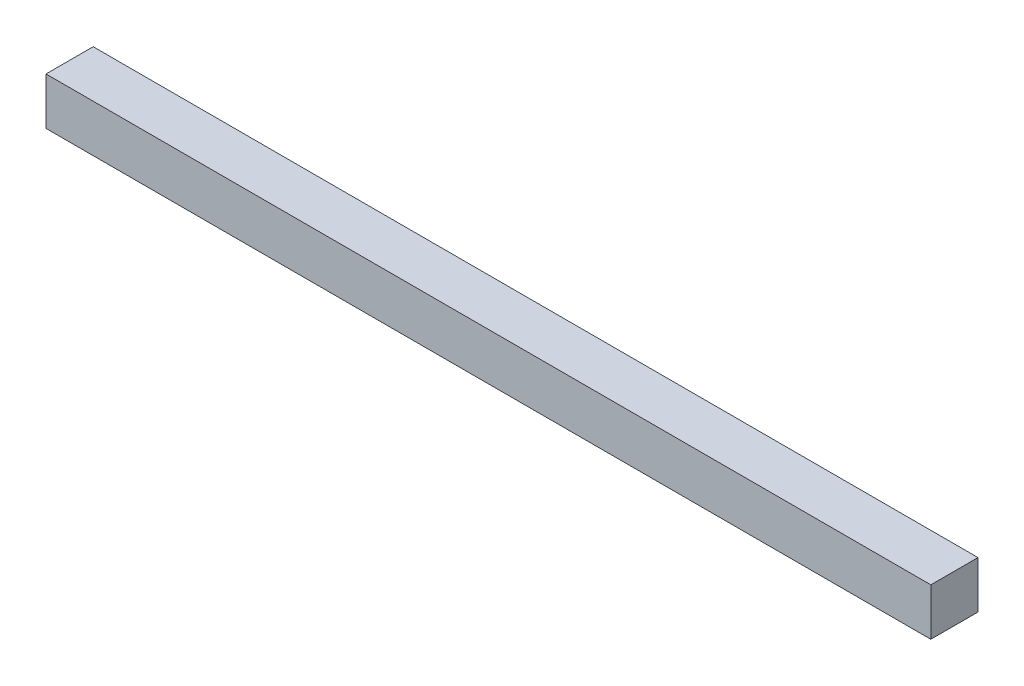
ISO-10303-21;
HEADER;
FILE_DESCRIPTION(('STEP AP214'),'2;1');
FILE_NAME('part.step','',(''),(''),'','','');
FILE_SCHEMA(('AUTOMOTIVE_DESIGN { 1 0 10303 214 1 1 1 1 }'));
ENDSEC;
DATA;
#1=APPLICATION_CONTEXT('core data for automotive mechanical design processes');
#2=APPLICATION_PROTOCOL_DEFINITION('international standard','automotive_design',2000,#1);
#3=PRODUCT_CONTEXT('',#1,'mechanical');
#4=PRODUCT('Part','Part','',(#3));
#5=PRODUCT_RELATED_PRODUCT_CATEGORY('part','',(#4));
#6=PRODUCT_DEFINITION_FORMATION('','',#4);
#7=PRODUCT_DEFINITION_CONTEXT('part definition',#1,'design');
#8=PRODUCT_DEFINITION('design','',#6,#7);
#9=PRODUCT_DEFINITION_SHAPE('','',#8);
#10=(LENGTH_UNIT() NAMED_UNIT(*) SI_UNIT(.MILLI.,.METRE.));
#11=(NAMED_UNIT(*) PLANE_ANGLE_UNIT() SI_UNIT($,.RADIAN.));
#12=(NAMED_UNIT(*) SI_UNIT($,.STERADIAN.) SOLID_ANGLE_UNIT());
#13=UNCERTAINTY_MEASURE_WITH_UNIT(LENGTH_MEASURE(1.E-05),#10,'distance_accuracy_value','');
#14=(GEOMETRIC_REPRESENTATION_CONTEXT(3) GLOBAL_UNCERTAINTY_ASSIGNED_CONTEXT((#13)) GLOBAL_UNIT_ASSIGNED_CONTEXT((#10,
#11,#12)) REPRESENTATION_CONTEXT('',''));
#15=CARTESIAN_POINT('',(0.,0.,0.));
#16=DIRECTION('',(0.,0.,1.));
#17=DIRECTION('',(1.,0.,0.));
#18=AXIS2_PLACEMENT_3D('',#15,#16,#17);
#19=CARTESIAN_POINT('',(0.,4.,0.));
#20=DIRECTION('',(1.,0.,0.));
#21=DIRECTION('',(0.,0.,-1.));
#22=AXIS2_PLACEMENT_3D('',#19,#20,#21);
#23=PLANE('',#22);
#24=DIRECTION('',(0.,0.,1.));
#25=VECTOR('',#24,1.);
#26=CARTESIAN_POINT('',(0.,0.,0.));
#27=LINE('',#26,#25);
#28=CARTESIAN_POINT('',(0.,0.,0.));
#29=VERTEX_POINT('',#28);
#30=CARTESIAN_POINT('',(0.,0.,4.));
#31=VERTEX_POINT('',#30);
#32=EDGE_CURVE('E96',#29,#31,#27,.T.);
#33=ORIENTED_EDGE('',*,*,#32,.T.);
#34=DIRECTION('',(0.,-1.,0.));
#35=VECTOR('',#34,1.);
#36=CARTESIAN_POINT('',(0.,4.,4.));
#37=LINE('',#36,#35);
#38=CARTESIAN_POINT('',(0.,4.,4.));
#39=VERTEX_POINT('',#38);
#40=EDGE_CURVE('E11',#39,#31,#37,.T.);
#41=ORIENTED_EDGE('',*,*,#40,.F.);
#42=DIRECTION('',(0.,0.,1.));
#43=VECTOR('',#42,1.);
#44=CARTESIAN_POINT('',(0.,4.,0.));
#45=LINE('',#44,#43);
#46=CARTESIAN_POINT('',(0.,4.,0.));
#47=VERTEX_POINT('',#46);
#48=EDGE_CURVE('E84',#47,#39,#45,.T.);
#49=ORIENTED_EDGE('',*,*,#48,.F.);
#50=DIRECTION('',(0.,-1.,0.));
#51=VECTOR('',#50,1.);
#52=CARTESIAN_POINT('',(0.,4.,0.));
#53=LINE('',#52,#51);
#54=EDGE_CURVE('E92',#47,#29,#53,.T.);
#55=ORIENTED_EDGE('',*,*,#54,.T.);
#56=EDGE_LOOP('',(#33,#41,#49,#55));
#57=FACE_BOUND('',#56,.T.);
#58=ADVANCED_FACE('F33',(#57),#23,.F.);
#59=CARTESIAN_POINT('',(0.,4.,4.));
#60=DIRECTION('',(0.,0.,-1.));
#61=DIRECTION('',(-1.,0.,0.));
#62=AXIS2_PLACEMENT_3D('',#59,#60,#61);
#63=PLANE('',#62);
#64=DIRECTION('',(1.,0.,0.));
#65=VECTOR('',#64,1.);
#66=CARTESIAN_POINT('',(0.,0.,4.));
#67=LINE('',#66,#65);
#68=CARTESIAN_POINT('',(75.,0.,4.));
#69=VERTEX_POINT('',#68);
#70=EDGE_CURVE('E88',#31,#69,#67,.T.);
#71=ORIENTED_EDGE('',*,*,#70,.T.);
#72=DIRECTION('',(0.,-1.,0.));
#73=VECTOR('',#72,1.);
#74=CARTESIAN_POINT('',(75.,4.,4.));
#75=LINE('',#74,#73);
#76=CARTESIAN_POINT('',(75.,4.,4.));
#77=VERTEX_POINT('',#76);
#78=EDGE_CURVE('E41',#77,#69,#75,.T.);
#79=ORIENTED_EDGE('',*,*,#78,.F.);
#80=DIRECTION('',(1.,0.,0.));
#81=VECTOR('',#80,1.);
#82=CARTESIAN_POINT('',(0.,4.,4.));
#83=LINE('',#82,#81);
#84=EDGE_CURVE('E79',#39,#77,#83,.T.);
#85=ORIENTED_EDGE('',*,*,#84,.F.);
#86=ORIENTED_EDGE('',*,*,#40,.T.);
#87=EDGE_LOOP('',(#71,#79,#85,#86));
#88=FACE_BOUND('',#87,.T.);
#89=ADVANCED_FACE('F87',(#88),#63,.F.);
#90=CARTESIAN_POINT('',(75.,4.,0.));
#91=DIRECTION('',(-1.,0.,0.));
#92=DIRECTION('',(0.,0.,1.));
#93=AXIS2_PLACEMENT_3D('',#90,#91,#92);
#94=PLANE('',#93);
#95=DIRECTION('',(0.,0.,-1.));
#96=VECTOR('',#95,1.);
#97=CARTESIAN_POINT('',(75.,0.,0.));
#98=LINE('',#97,#96);
#99=CARTESIAN_POINT('',(75.,0.,0.));
#100=VERTEX_POINT('',#99);
#101=EDGE_CURVE('E66',#69,#100,#98,.T.);
#102=ORIENTED_EDGE('',*,*,#101,.T.);
#103=DIRECTION('',(0.,-1.,0.));
#104=VECTOR('',#103,1.);
#105=CARTESIAN_POINT('',(75.,4.,0.));
#106=LINE('',#105,#104);
#107=CARTESIAN_POINT('',(75.,4.,0.));
#108=VERTEX_POINT('',#107);
#109=EDGE_CURVE('E89',#108,#100,#106,.T.);
#110=ORIENTED_EDGE('',*,*,#109,.F.);
#111=DIRECTION('',(0.,0.,-1.));
#112=VECTOR('',#111,1.);
#113=CARTESIAN_POINT('',(75.,4.,0.));
#114=LINE('',#113,#112);
#115=EDGE_CURVE('E82',#77,#108,#114,.T.);
#116=ORIENTED_EDGE('',*,*,#115,.F.);
#117=ORIENTED_EDGE('',*,*,#78,.T.);
#118=EDGE_LOOP('',(#102,#110,#116,#117));
#119=FACE_BOUND('',#118,.T.);
#120=ADVANCED_FACE('F90',(#119),#94,.F.);
#121=CARTESIAN_POINT('',(0.,4.,0.));
#122=DIRECTION('',(0.,0.,1.));
#123=DIRECTION('',(1.,0.,0.));
#124=AXIS2_PLACEMENT_3D('',#121,#122,#123);
#125=PLANE('',#124);
#126=DIRECTION('',(-1.,0.,0.));
#127=VECTOR('',#126,1.);
#128=CARTESIAN_POINT('',(0.,0.,0.));
#129=LINE('',#128,#127);
#130=EDGE_CURVE('E72',#100,#29,#129,.T.);
#131=ORIENTED_EDGE('',*,*,#130,.T.);
#132=ORIENTED_EDGE('',*,*,#54,.F.);
#133=DIRECTION('',(-1.,0.,0.));
#134=VECTOR('',#133,1.);
#135=CARTESIAN_POINT('',(0.,4.,0.));
#136=LINE('',#135,#134);
#137=EDGE_CURVE('E49',#108,#47,#136,.T.);
#138=ORIENTED_EDGE('',*,*,#137,.F.);
#139=ORIENTED_EDGE('',*,*,#109,.T.);
#140=EDGE_LOOP('',(#131,#132,#138,#139));
#141=FACE_BOUND('',#140,.T.);
#142=ADVANCED_FACE('F103',(#141),#125,.F.);
#143=CARTESIAN_POINT('',(0.,4.,0.));
#144=DIRECTION('',(0.,1.,0.));
#145=DIRECTION('',(0.,0.,1.));
#146=AXIS2_PLACEMENT_3D('',#143,#144,#145);
#147=PLANE('',#146);
#148=ORIENTED_EDGE('',*,*,#48,.T.);
#149=ORIENTED_EDGE('',*,*,#84,.T.);
#150=ORIENTED_EDGE('',*,*,#115,.T.);
#151=ORIENTED_EDGE('',*,*,#137,.T.);
#152=EDGE_LOOP('',(#148,#149,#150,#151));
#153=FACE_BOUND('',#152,.T.);
#154=ADVANCED_FACE('F80',(#153),#147,.T.);
#155=CARTESIAN_POINT('',(0.,0.,0.));
#156=DIRECTION('',(0.,1.,0.));
#157=DIRECTION('',(0.,0.,1.));
#158=AXIS2_PLACEMENT_3D('',#155,#156,#157);
#159=PLANE('',#158);
#160=ORIENTED_EDGE('',*,*,#32,.F.);
#161=ORIENTED_EDGE('',*,*,#130,.F.);
#162=ORIENTED_EDGE('',*,*,#101,.F.);
#163=ORIENTED_EDGE('',*,*,#70,.F.);
#164=EDGE_LOOP('',(#160,#161,#162,#163));
#165=FACE_BOUND('',#164,.T.);
#166=ADVANCED_FACE('F106',(#165),#159,.F.);
#167=CLOSED_SHELL('',(#58,#89,#120,#142,#154,#166));
#168=MANIFOLD_SOLID_BREP('B2',#167);
#169=ADVANCED_BREP_SHAPE_REPRESENTATION('',(#18,#168),#14);
#170=SHAPE_DEFINITION_REPRESENTATION(#9,#169);
ENDSEC;
END-ISO-10303-21;
